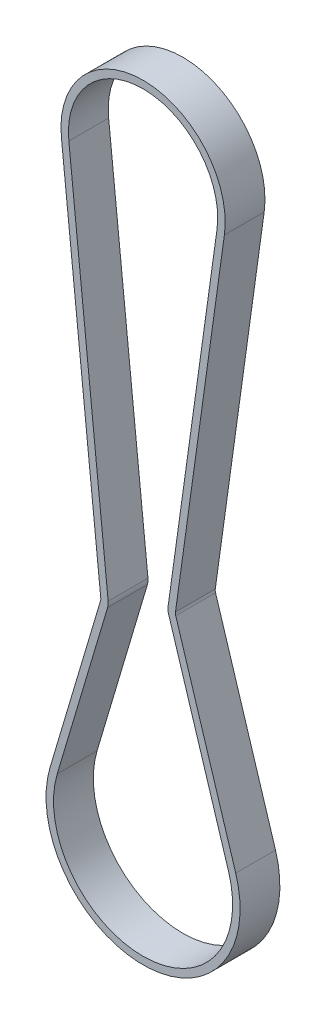
ISO-10303-21;
HEADER;
FILE_DESCRIPTION(('STEP AP214'),'2;1');
FILE_NAME('part.step','',(''),(''),'','','');
FILE_SCHEMA(('AUTOMOTIVE_DESIGN { 1 0 10303 214 1 1 1 1 }'));
ENDSEC;
DATA;
#1=APPLICATION_CONTEXT('core data for automotive mechanical design processes');
#2=APPLICATION_PROTOCOL_DEFINITION('international standard','automotive_design',2000,#1);
#3=PRODUCT_CONTEXT('',#1,'mechanical');
#4=PRODUCT('Part','Part','',(#3));
#5=PRODUCT_RELATED_PRODUCT_CATEGORY('part','',(#4));
#6=PRODUCT_DEFINITION_FORMATION('','',#4);
#7=PRODUCT_DEFINITION_CONTEXT('part definition',#1,'design');
#8=PRODUCT_DEFINITION('design','',#6,#7);
#9=PRODUCT_DEFINITION_SHAPE('','',#8);
#10=(LENGTH_UNIT() NAMED_UNIT(*) SI_UNIT(.MILLI.,.METRE.));
#11=(NAMED_UNIT(*) PLANE_ANGLE_UNIT() SI_UNIT($,.RADIAN.));
#12=(NAMED_UNIT(*) SI_UNIT($,.STERADIAN.) SOLID_ANGLE_UNIT());
#13=UNCERTAINTY_MEASURE_WITH_UNIT(LENGTH_MEASURE(1.E-05),#10,'distance_accuracy_value','');
#14=(GEOMETRIC_REPRESENTATION_CONTEXT(3) GLOBAL_UNCERTAINTY_ASSIGNED_CONTEXT((#13)) GLOBAL_UNIT_ASSIGNED_CONTEXT((#10,
#11,#12)) REPRESENTATION_CONTEXT('',''));
#15=CARTESIAN_POINT('',(0.,0.,0.));
#16=DIRECTION('',(0.,0.,1.));
#17=DIRECTION('',(1.,0.,0.));
#18=AXIS2_PLACEMENT_3D('',#15,#16,#17);
#19=CARTESIAN_POINT('',(8.00000000000001,3.30398469508521,8.));
#20=DIRECTION('',(0.,0.,1.));
#21=DIRECTION('',(1.,0.,0.));
#22=AXIS2_PLACEMENT_3D('',#19,#20,#21);
#23=PLANE('',#22);
#24=DIRECTION('',(-0.138035364293995,-0.990427300817291,0.));
#25=VECTOR('',#24,1.);
#26=CARTESIAN_POINT('',(16.3420504634853,74.0264011842343,8.));
#27=LINE('',#26,#25);
#28=CARTESIAN_POINT('',(16.3420504634853,74.0264011842343,8.));
#29=VERTEX_POINT('',#28);
#30=CARTESIAN_POINT('',(6.51435904877407,3.5110377415262,8.));
#31=VERTEX_POINT('',#30);
#32=EDGE_CURVE('E262',#29,#31,#27,.T.);
#33=ORIENTED_EDGE('',*,*,#32,.F.);
#34=CARTESIAN_POINT('',(0.,76.3039846950852,8.));
#35=DIRECTION('',(0.,0.,1.));
#36=DIRECTION('',(1.,0.,0.));
#37=AXIS2_PLACEMENT_3D('',#34,#35,#36);
#38=CIRCLE('',#37,16.5);
#39=CARTESIAN_POINT('',(-16.4118159133176,74.6003713506388,8.));
#40=VERTEX_POINT('',#39);
#41=EDGE_CURVE('E281',#29,#40,#38,.T.);
#42=ORIENTED_EDGE('',*,*,#41,.T.);
#43=DIRECTION('',(0.103249293602816,-0.994655509898035,0.));
#44=VECTOR('',#43,1.);
#45=CARTESIAN_POINT('',(-16.4118159133176,74.6003713506387,8.));
#46=LINE('',#45,#44);
#47=CARTESIAN_POINT('',(-8.50801673515294,-1.54114136451057,8.));
#48=VERTEX_POINT('',#47);
#49=EDGE_CURVE('E279',#40,#48,#46,.T.);
#50=ORIENTED_EDGE('',*,*,#49,.T.);
#51=CARTESIAN_POINT('',(-9.99999999999999,-1.69601530491479,8.));
#52=DIRECTION('',(0.,0.,1.));
#53=DIRECTION('',(1.,0.,0.));
#54=AXIS2_PLACEMENT_3D('',#51,#52,#53);
#55=CIRCLE('',#54,1.5);
#56=CARTESIAN_POINT('',(-8.56238623534986,-2.12411186375226,8.));
#57=VERTEX_POINT('',#56);
#58=EDGE_CURVE('E276',#57,#48,#55,.T.);
#59=ORIENTED_EDGE('',*,*,#58,.F.);
#60=DIRECTION('',(-0.285397705891645,-0.95840917643342,0.));
#61=VECTOR('',#60,1.);
#62=CARTESIAN_POINT('',(-8.56238623534986,-2.12411186375226,8.));
#63=LINE('',#62,#61);
#64=CARTESIAN_POINT('',(-18.6889789404517,-36.1307600400277,8.));
#65=VERTEX_POINT('',#64);
#66=EDGE_CURVE('E274',#57,#65,#63,.T.);
#67=ORIENTED_EDGE('',*,*,#66,.T.);
#68=CARTESIAN_POINT('',(0.,-41.6960153049148,8.));
#69=DIRECTION('',(0.,0.,1.));
#70=DIRECTION('',(1.,0.,0.));
#71=AXIS2_PLACEMENT_3D('',#68,#69,#70);
#72=CIRCLE('',#71,19.5);
#73=CARTESIAN_POINT('',(18.6206842477136,-35.906359171175,8.));
#74=VERTEX_POINT('',#73);
#75=EDGE_CURVE('E272',#65,#74,#72,.T.);
#76=ORIENTED_EDGE('',*,*,#75,.T.);
#77=DIRECTION('',(0.296905442755887,-0.954906884498133,0.));
#78=VECTOR('',#77,1.);
#79=CARTESIAN_POINT('',(6.56763967325281,2.85862653095138,8.));
#80=LINE('',#79,#78);
#81=CARTESIAN_POINT('',(6.56763967325281,2.85862653095138,8.));
#82=VERTEX_POINT('',#81);
#83=EDGE_CURVE('E269',#82,#74,#80,.T.);
#84=ORIENTED_EDGE('',*,*,#83,.F.);
#85=CARTESIAN_POINT('',(8.00000000000001,3.30398469508521,8.));
#86=DIRECTION('',(0.,0.,1.));
#87=DIRECTION('',(1.,0.,0.));
#88=AXIS2_PLACEMENT_3D('',#85,#86,#87);
#89=CIRCLE('',#88,1.5);
#90=EDGE_CURVE('E265',#31,#82,#89,.T.);
#91=ORIENTED_EDGE('',*,*,#90,.F.);
#92=EDGE_LOOP('',(#33,#42,#50,#59,#67,#76,#84,#91));
#93=FACE_BOUND('',#92,.T.);
#94=DIRECTION('',(0.103249293602816,-0.994655509898035,0.));
#95=VECTOR('',#94,1.);
#96=CARTESIAN_POINT('',(-14.9198326484705,74.755245291043,8.));
#97=LINE('',#96,#95);
#98=CARTESIAN_POINT('',(-14.9198326484705,74.755245291043,8.));
#99=VERTEX_POINT('',#98);
#100=CARTESIAN_POINT('',(-7.01603347030589,-1.38626742410634,8.));
#101=VERTEX_POINT('',#100);
#102=EDGE_CURVE('E203',#99,#101,#97,.T.);
#103=ORIENTED_EDGE('',*,*,#102,.F.);
#104=CARTESIAN_POINT('',(0.,76.3039846950852,8.));
#105=DIRECTION('',(0.,0.,1.));
#106=DIRECTION('',(1.,0.,0.));
#107=AXIS2_PLACEMENT_3D('',#104,#105,#106);
#108=CIRCLE('',#107,15.);
#109=CARTESIAN_POINT('',(14.8564095122594,74.2334542306753,8.));
#110=VERTEX_POINT('',#109);
#111=EDGE_CURVE('E194',#110,#99,#108,.T.);
#112=ORIENTED_EDGE('',*,*,#111,.F.);
#113=DIRECTION('',(-0.138035364293995,-0.990427300817291,0.));
#114=VECTOR('',#113,1.);
#115=CARTESIAN_POINT('',(14.8564095122594,74.2334542306753,8.));
#116=LINE('',#115,#114);
#117=CARTESIAN_POINT('',(5.02871809754814,3.7180907879672,8.));
#118=VERTEX_POINT('',#117);
#119=EDGE_CURVE('E229',#110,#118,#116,.T.);
#120=ORIENTED_EDGE('',*,*,#119,.T.);
#121=CARTESIAN_POINT('',(8.00000000000001,3.30398469508521,8.));
#122=DIRECTION('',(0.,0.,1.));
#123=DIRECTION('',(1.,0.,0.));
#124=AXIS2_PLACEMENT_3D('',#121,#122,#123);
#125=CIRCLE('',#124,3.);
#126=CARTESIAN_POINT('',(5.13527934650561,2.41326836681755,8.));
#127=VERTEX_POINT('',#126);
#128=EDGE_CURVE('E98',#118,#127,#125,.T.);
#129=ORIENTED_EDGE('',*,*,#128,.T.);
#130=DIRECTION('',(0.296905442755888,-0.954906884498133,0.));
#131=VECTOR('',#130,1.);
#132=CARTESIAN_POINT('',(5.13527934650561,2.41326836681755,8.));
#133=LINE('',#132,#131);
#134=CARTESIAN_POINT('',(17.1883239209664,-36.3517173353088,8.));
#135=VERTEX_POINT('',#134);
#136=EDGE_CURVE('E225',#127,#135,#133,.T.);
#137=ORIENTED_EDGE('',*,*,#136,.T.);
#138=CARTESIAN_POINT('',(0.,-41.6960153049148,8.));
#139=DIRECTION('',(0.,0.,1.));
#140=DIRECTION('',(1.,0.,0.));
#141=AXIS2_PLACEMENT_3D('',#138,#139,#140);
#142=CIRCLE('',#141,18.);
#143=CARTESIAN_POINT('',(-17.2513651758015,-36.5588565988652,8.));
#144=VERTEX_POINT('',#143);
#145=EDGE_CURVE('E223',#144,#135,#142,.T.);
#146=ORIENTED_EDGE('',*,*,#145,.F.);
#147=DIRECTION('',(-0.285397705891645,-0.95840917643342,0.));
#148=VECTOR('',#147,1.);
#149=CARTESIAN_POINT('',(-7.12477247069974,-2.55220842258972,8.));
#150=LINE('',#149,#148);
#151=CARTESIAN_POINT('',(-7.12477247069973,-2.55220842258973,8.));
#152=VERTEX_POINT('',#151);
#153=EDGE_CURVE('E219',#152,#144,#150,.T.);
#154=ORIENTED_EDGE('',*,*,#153,.F.);
#155=CARTESIAN_POINT('',(-9.99999999999999,-1.69601530491479,8.));
#156=DIRECTION('',(0.,0.,1.));
#157=DIRECTION('',(1.,0.,0.));
#158=AXIS2_PLACEMENT_3D('',#155,#156,#157);
#159=CIRCLE('',#158,3.);
#160=EDGE_CURVE('E217',#152,#101,#159,.T.);
#161=ORIENTED_EDGE('',*,*,#160,.T.);
#162=EDGE_LOOP('',(#103,#112,#120,#129,#137,#146,#154,#161));
#163=FACE_BOUND('',#162,.T.);
#164=ADVANCED_FACE('F81',(#93,#163),#23,.T.);
#165=CARTESIAN_POINT('',(8.00000000000001,3.30398469508521,0.));
#166=DIRECTION('',(0.,0.,1.));
#167=DIRECTION('',(1.,0.,0.));
#168=AXIS2_PLACEMENT_3D('',#165,#166,#167);
#169=PLANE('',#168);
#170=DIRECTION('',(-0.138035364293995,-0.990427300817291,0.));
#171=VECTOR('',#170,1.);
#172=CARTESIAN_POINT('',(16.3420504634853,74.0264011842343,0.));
#173=LINE('',#172,#171);
#174=CARTESIAN_POINT('',(16.3420504634853,74.0264011842343,0.));
#175=VERTEX_POINT('',#174);
#176=CARTESIAN_POINT('',(6.51435904877407,3.5110377415262,0.));
#177=VERTEX_POINT('',#176);
#178=EDGE_CURVE('E211',#175,#177,#173,.T.);
#179=ORIENTED_EDGE('',*,*,#178,.T.);
#180=CARTESIAN_POINT('',(8.00000000000001,3.30398469508521,0.));
#181=DIRECTION('',(0.,0.,1.));
#182=DIRECTION('',(1.,0.,0.));
#183=AXIS2_PLACEMENT_3D('',#180,#181,#182);
#184=CIRCLE('',#183,1.5);
#185=CARTESIAN_POINT('',(6.56763967325281,2.85862653095138,0.));
#186=VERTEX_POINT('',#185);
#187=EDGE_CURVE('E285',#177,#186,#184,.T.);
#188=ORIENTED_EDGE('',*,*,#187,.T.);
#189=DIRECTION('',(0.296905442755887,-0.954906884498133,0.));
#190=VECTOR('',#189,1.);
#191=CARTESIAN_POINT('',(6.56763967325281,2.85862653095138,0.));
#192=LINE('',#191,#190);
#193=CARTESIAN_POINT('',(18.6206842477136,-35.906359171175,0.));
#194=VERTEX_POINT('',#193);
#195=EDGE_CURVE('E288',#186,#194,#192,.T.);
#196=ORIENTED_EDGE('',*,*,#195,.T.);
#197=CARTESIAN_POINT('',(0.,-41.6960153049148,0.));
#198=DIRECTION('',(0.,0.,1.));
#199=DIRECTION('',(1.,0.,0.));
#200=AXIS2_PLACEMENT_3D('',#197,#198,#199);
#201=CIRCLE('',#200,19.5);
#202=CARTESIAN_POINT('',(-18.6889789404517,-36.1307600400277,0.));
#203=VERTEX_POINT('',#202);
#204=EDGE_CURVE('E291',#203,#194,#201,.T.);
#205=ORIENTED_EDGE('',*,*,#204,.F.);
#206=DIRECTION('',(-0.285397705891645,-0.95840917643342,0.));
#207=VECTOR('',#206,1.);
#208=CARTESIAN_POINT('',(-8.56238623534986,-2.12411186375226,0.));
#209=LINE('',#208,#207);
#210=CARTESIAN_POINT('',(-8.56238623534986,-2.12411186375226,0.));
#211=VERTEX_POINT('',#210);
#212=EDGE_CURVE('E294',#211,#203,#209,.T.);
#213=ORIENTED_EDGE('',*,*,#212,.F.);
#214=CARTESIAN_POINT('',(-9.99999999999999,-1.69601530491479,0.));
#215=DIRECTION('',(0.,0.,1.));
#216=DIRECTION('',(1.,0.,0.));
#217=AXIS2_PLACEMENT_3D('',#214,#215,#216);
#218=CIRCLE('',#217,1.5);
#219=CARTESIAN_POINT('',(-8.50801673515294,-1.54114136451057,0.));
#220=VERTEX_POINT('',#219);
#221=EDGE_CURVE('E296',#211,#220,#218,.T.);
#222=ORIENTED_EDGE('',*,*,#221,.T.);
#223=DIRECTION('',(0.103249293602816,-0.994655509898035,0.));
#224=VECTOR('',#223,1.);
#225=CARTESIAN_POINT('',(-16.4118159133176,74.6003713506387,0.));
#226=LINE('',#225,#224);
#227=CARTESIAN_POINT('',(-16.4118159133176,74.6003713506388,0.));
#228=VERTEX_POINT('',#227);
#229=EDGE_CURVE('E299',#228,#220,#226,.T.);
#230=ORIENTED_EDGE('',*,*,#229,.F.);
#231=CARTESIAN_POINT('',(0.,76.3039846950852,0.));
#232=DIRECTION('',(0.,0.,1.));
#233=DIRECTION('',(1.,0.,0.));
#234=AXIS2_PLACEMENT_3D('',#231,#232,#233);
#235=CIRCLE('',#234,16.5);
#236=EDGE_CURVE('E266',#175,#228,#235,.T.);
#237=ORIENTED_EDGE('',*,*,#236,.F.);
#238=EDGE_LOOP('',(#179,#188,#196,#205,#213,#222,#230,#237));
#239=FACE_BOUND('',#238,.T.);
#240=CARTESIAN_POINT('',(0.,76.3039846950852,0.));
#241=DIRECTION('',(0.,0.,1.));
#242=DIRECTION('',(1.,0.,0.));
#243=AXIS2_PLACEMENT_3D('',#240,#241,#242);
#244=CIRCLE('',#243,15.);
#245=CARTESIAN_POINT('',(14.8564095122594,74.2334542306753,0.));
#246=VERTEX_POINT('',#245);
#247=CARTESIAN_POINT('',(-14.9198326484705,74.755245291043,0.));
#248=VERTEX_POINT('',#247);
#249=EDGE_CURVE('E106',#246,#248,#244,.T.);
#250=ORIENTED_EDGE('',*,*,#249,.T.);
#251=DIRECTION('',(0.103249293602816,-0.994655509898035,0.));
#252=VECTOR('',#251,1.);
#253=CARTESIAN_POINT('',(-14.9198326484705,74.755245291043,0.));
#254=LINE('',#253,#252);
#255=CARTESIAN_POINT('',(-7.01603347030589,-1.38626742410634,0.));
#256=VERTEX_POINT('',#255);
#257=EDGE_CURVE('E210',#248,#256,#254,.T.);
#258=ORIENTED_EDGE('',*,*,#257,.T.);
#259=CARTESIAN_POINT('',(-9.99999999999999,-1.69601530491479,0.));
#260=DIRECTION('',(0.,0.,1.));
#261=DIRECTION('',(1.,0.,0.));
#262=AXIS2_PLACEMENT_3D('',#259,#260,#261);
#263=CIRCLE('',#262,3.);
#264=CARTESIAN_POINT('',(-7.12477247069973,-2.55220842258973,0.));
#265=VERTEX_POINT('',#264);
#266=EDGE_CURVE('E233',#265,#256,#263,.T.);
#267=ORIENTED_EDGE('',*,*,#266,.F.);
#268=DIRECTION('',(-0.285397705891645,-0.95840917643342,0.));
#269=VECTOR('',#268,1.);
#270=CARTESIAN_POINT('',(-7.12477247069974,-2.55220842258972,0.));
#271=LINE('',#270,#269);
#272=CARTESIAN_POINT('',(-17.2513651758015,-36.5588565988652,0.));
#273=VERTEX_POINT('',#272);
#274=EDGE_CURVE('E236',#265,#273,#271,.T.);
#275=ORIENTED_EDGE('',*,*,#274,.T.);
#276=CARTESIAN_POINT('',(0.,-41.6960153049148,0.));
#277=DIRECTION('',(0.,0.,1.));
#278=DIRECTION('',(1.,0.,0.));
#279=AXIS2_PLACEMENT_3D('',#276,#277,#278);
#280=CIRCLE('',#279,18.);
#281=CARTESIAN_POINT('',(17.1883239209664,-36.3517173353088,0.));
#282=VERTEX_POINT('',#281);
#283=EDGE_CURVE('E239',#273,#282,#280,.T.);
#284=ORIENTED_EDGE('',*,*,#283,.T.);
#285=DIRECTION('',(0.296905442755888,-0.954906884498133,0.));
#286=VECTOR('',#285,1.);
#287=CARTESIAN_POINT('',(5.13527934650561,2.41326836681755,0.));
#288=LINE('',#287,#286);
#289=CARTESIAN_POINT('',(5.13527934650561,2.41326836681755,0.));
#290=VERTEX_POINT('',#289);
#291=EDGE_CURVE('E242',#290,#282,#288,.T.);
#292=ORIENTED_EDGE('',*,*,#291,.F.);
#293=CARTESIAN_POINT('',(8.00000000000001,3.30398469508521,0.));
#294=DIRECTION('',(0.,0.,1.));
#295=DIRECTION('',(1.,0.,0.));
#296=AXIS2_PLACEMENT_3D('',#293,#294,#295);
#297=CIRCLE('',#296,3.);
#298=CARTESIAN_POINT('',(5.02871809754814,3.7180907879672,0.));
#299=VERTEX_POINT('',#298);
#300=EDGE_CURVE('E245',#299,#290,#297,.T.);
#301=ORIENTED_EDGE('',*,*,#300,.F.);
#302=DIRECTION('',(-0.138035364293995,-0.990427300817291,0.));
#303=VECTOR('',#302,1.);
#304=CARTESIAN_POINT('',(14.8564095122594,74.2334542306753,0.));
#305=LINE('',#304,#303);
#306=EDGE_CURVE('E204',#246,#299,#305,.T.);
#307=ORIENTED_EDGE('',*,*,#306,.F.);
#308=EDGE_LOOP('',(#250,#258,#267,#275,#284,#292,#301,#307));
#309=FACE_BOUND('',#308,.T.);
#310=ADVANCED_FACE('F324',(#239,#309),#169,.F.);
#311=CARTESIAN_POINT('',(16.3420504634853,74.0264011842343,8.));
#312=DIRECTION('',(0.990427300817291,-0.138035364293995,0.));
#313=DIRECTION('',(0.138035364293995,0.990427300817291,0.));
#314=AXIS2_PLACEMENT_3D('',#311,#312,#313);
#315=PLANE('',#314);
#316=ORIENTED_EDGE('',*,*,#178,.F.);
#317=DIRECTION('',(0.,0.,-1.));
#318=VECTOR('',#317,1.);
#319=CARTESIAN_POINT('',(16.3420504634853,74.0264011842343,8.));
#320=LINE('',#319,#318);
#321=EDGE_CURVE('E12',#29,#175,#320,.T.);
#322=ORIENTED_EDGE('',*,*,#321,.F.);
#323=ORIENTED_EDGE('',*,*,#32,.T.);
#324=DIRECTION('',(0.,0.,-1.));
#325=VECTOR('',#324,1.);
#326=CARTESIAN_POINT('',(6.51435904877407,3.5110377415262,8.));
#327=LINE('',#326,#325);
#328=EDGE_CURVE('E85',#31,#177,#327,.T.);
#329=ORIENTED_EDGE('',*,*,#328,.T.);
#330=EDGE_LOOP('',(#316,#322,#323,#329));
#331=FACE_BOUND('',#330,.T.);
#332=ADVANCED_FACE('F83',(#331),#315,.T.);
#333=CARTESIAN_POINT('',(0.,76.3039846950852,8.));
#334=DIRECTION('',(0.,0.,-1.));
#335=DIRECTION('',(-1.,0.,0.));
#336=AXIS2_PLACEMENT_3D('',#333,#334,#335);
#337=CYLINDRICAL_SURFACE('',#336,16.5);
#338=ORIENTED_EDGE('',*,*,#236,.T.);
#339=DIRECTION('',(0.,0.,-1.));
#340=VECTOR('',#339,1.);
#341=CARTESIAN_POINT('',(-16.4118159133176,74.6003713506388,8.));
#342=LINE('',#341,#340);
#343=EDGE_CURVE('E90',#40,#228,#342,.T.);
#344=ORIENTED_EDGE('',*,*,#343,.F.);
#345=ORIENTED_EDGE('',*,*,#41,.F.);
#346=ORIENTED_EDGE('',*,*,#321,.T.);
#347=EDGE_LOOP('',(#338,#344,#345,#346));
#348=FACE_BOUND('',#347,.T.);
#349=ADVANCED_FACE('F329',(#348),#337,.T.);
#350=CARTESIAN_POINT('',(-16.4118159133176,74.6003713506387,8.));
#351=DIRECTION('',(0.994655509898035,0.103249293602816,0.));
#352=DIRECTION('',(-0.103249293602816,0.994655509898035,0.));
#353=AXIS2_PLACEMENT_3D('',#350,#351,#352);
#354=PLANE('',#353);
#355=ORIENTED_EDGE('',*,*,#229,.T.);
#356=DIRECTION('',(0.,0.,-1.));
#357=VECTOR('',#356,1.);
#358=CARTESIAN_POINT('',(-8.50801673515294,-1.54114136451057,8.));
#359=LINE('',#358,#357);
#360=EDGE_CURVE('E305',#48,#220,#359,.T.);
#361=ORIENTED_EDGE('',*,*,#360,.F.);
#362=ORIENTED_EDGE('',*,*,#49,.F.);
#363=ORIENTED_EDGE('',*,*,#343,.T.);
#364=EDGE_LOOP('',(#355,#361,#362,#363));
#365=FACE_BOUND('',#364,.T.);
#366=ADVANCED_FACE('F333',(#365),#354,.F.);
#367=CARTESIAN_POINT('',(-9.99999999999999,-1.69601530491479,8.));
#368=DIRECTION('',(0.,0.,-1.));
#369=DIRECTION('',(-1.,0.,0.));
#370=AXIS2_PLACEMENT_3D('',#367,#368,#369);
#371=CYLINDRICAL_SURFACE('',#370,1.5);
#372=ORIENTED_EDGE('',*,*,#221,.F.);
#373=DIRECTION('',(0.,0.,-1.));
#374=VECTOR('',#373,1.);
#375=CARTESIAN_POINT('',(-8.56238623534986,-2.12411186375226,8.));
#376=LINE('',#375,#374);
#377=EDGE_CURVE('E307',#57,#211,#376,.T.);
#378=ORIENTED_EDGE('',*,*,#377,.F.);
#379=ORIENTED_EDGE('',*,*,#58,.T.);
#380=ORIENTED_EDGE('',*,*,#360,.T.);
#381=EDGE_LOOP('',(#372,#378,#379,#380));
#382=FACE_BOUND('',#381,.T.);
#383=ADVANCED_FACE('F352',(#382),#371,.F.);
#384=CARTESIAN_POINT('',(-8.56238623534986,-2.12411186375226,8.));
#385=DIRECTION('',(0.95840917643342,-0.285397705891645,0.));
#386=DIRECTION('',(0.285397705891645,0.95840917643342,0.));
#387=AXIS2_PLACEMENT_3D('',#384,#385,#386);
#388=PLANE('',#387);
#389=ORIENTED_EDGE('',*,*,#212,.T.);
#390=DIRECTION('',(0.,0.,-1.));
#391=VECTOR('',#390,1.);
#392=CARTESIAN_POINT('',(-18.6889789404517,-36.1307600400277,8.));
#393=LINE('',#392,#391);
#394=EDGE_CURVE('E309',#65,#203,#393,.T.);
#395=ORIENTED_EDGE('',*,*,#394,.F.);
#396=ORIENTED_EDGE('',*,*,#66,.F.);
#397=ORIENTED_EDGE('',*,*,#377,.T.);
#398=EDGE_LOOP('',(#389,#395,#396,#397));
#399=FACE_BOUND('',#398,.T.);
#400=ADVANCED_FACE('F350',(#399),#388,.F.);
#401=CARTESIAN_POINT('',(0.,-41.6960153049148,8.));
#402=DIRECTION('',(0.,0.,-1.));
#403=DIRECTION('',(-1.,0.,0.));
#404=AXIS2_PLACEMENT_3D('',#401,#402,#403);
#405=CYLINDRICAL_SURFACE('',#404,19.5);
#406=ORIENTED_EDGE('',*,*,#204,.T.);
#407=DIRECTION('',(0.,0.,-1.));
#408=VECTOR('',#407,1.);
#409=CARTESIAN_POINT('',(18.6206842477136,-35.906359171175,8.));
#410=LINE('',#409,#408);
#411=EDGE_CURVE('E312',#74,#194,#410,.T.);
#412=ORIENTED_EDGE('',*,*,#411,.F.);
#413=ORIENTED_EDGE('',*,*,#75,.F.);
#414=ORIENTED_EDGE('',*,*,#394,.T.);
#415=EDGE_LOOP('',(#406,#412,#413,#414));
#416=FACE_BOUND('',#415,.T.);
#417=ADVANCED_FACE('F346',(#416),#405,.T.);
#418=CARTESIAN_POINT('',(6.56763967325281,2.85862653095138,8.));
#419=DIRECTION('',(0.954906884498133,0.296905442755887,0.));
#420=DIRECTION('',(-0.296905442755887,0.954906884498133,0.));
#421=AXIS2_PLACEMENT_3D('',#418,#419,#420);
#422=PLANE('',#421);
#423=ORIENTED_EDGE('',*,*,#195,.F.);
#424=DIRECTION('',(0.,0.,-1.));
#425=VECTOR('',#424,1.);
#426=CARTESIAN_POINT('',(6.56763967325281,2.85862653095138,8.));
#427=LINE('',#426,#425);
#428=EDGE_CURVE('E313',#82,#186,#427,.T.);
#429=ORIENTED_EDGE('',*,*,#428,.F.);
#430=ORIENTED_EDGE('',*,*,#83,.T.);
#431=ORIENTED_EDGE('',*,*,#411,.T.);
#432=EDGE_LOOP('',(#423,#429,#430,#431));
#433=FACE_BOUND('',#432,.T.);
#434=ADVANCED_FACE('F341',(#433),#422,.T.);
#435=CARTESIAN_POINT('',(8.00000000000001,3.30398469508521,8.));
#436=DIRECTION('',(0.,0.,-1.));
#437=DIRECTION('',(-1.,0.,0.));
#438=AXIS2_PLACEMENT_3D('',#435,#436,#437);
#439=CYLINDRICAL_SURFACE('',#438,1.5);
#440=ORIENTED_EDGE('',*,*,#187,.F.);
#441=ORIENTED_EDGE('',*,*,#328,.F.);
#442=ORIENTED_EDGE('',*,*,#90,.T.);
#443=ORIENTED_EDGE('',*,*,#428,.T.);
#444=EDGE_LOOP('',(#440,#441,#442,#443));
#445=FACE_BOUND('',#444,.T.);
#446=ADVANCED_FACE('F321',(#445),#439,.F.);
#447=CARTESIAN_POINT('',(0.,76.3039846950852,8.));
#448=DIRECTION('',(0.,0.,-1.));
#449=DIRECTION('',(-1.,0.,0.));
#450=AXIS2_PLACEMENT_3D('',#447,#448,#449);
#451=CYLINDRICAL_SURFACE('',#450,15.);
#452=ORIENTED_EDGE('',*,*,#249,.F.);
#453=DIRECTION('',(0.,0.,-1.));
#454=VECTOR('',#453,1.);
#455=CARTESIAN_POINT('',(14.8564095122594,74.2334542306753,8.));
#456=LINE('',#455,#454);
#457=EDGE_CURVE('E198',#110,#246,#456,.T.);
#458=ORIENTED_EDGE('',*,*,#457,.F.);
#459=ORIENTED_EDGE('',*,*,#111,.T.);
#460=DIRECTION('',(0.,0.,-1.));
#461=VECTOR('',#460,1.);
#462=CARTESIAN_POINT('',(-14.9198326484705,74.755245291043,8.));
#463=LINE('',#462,#461);
#464=EDGE_CURVE('E197',#99,#248,#463,.T.);
#465=ORIENTED_EDGE('',*,*,#464,.T.);
#466=EDGE_LOOP('',(#452,#458,#459,#465));
#467=FACE_BOUND('',#466,.T.);
#468=ADVANCED_FACE('F196',(#467),#451,.F.);
#469=CARTESIAN_POINT('',(-14.9198326484705,74.755245291043,8.));
#470=DIRECTION('',(0.994655509898035,0.103249293602816,0.));
#471=DIRECTION('',(-0.103249293602816,0.994655509898035,0.));
#472=AXIS2_PLACEMENT_3D('',#469,#470,#471);
#473=PLANE('',#472);
#474=ORIENTED_EDGE('',*,*,#257,.F.);
#475=ORIENTED_EDGE('',*,*,#464,.F.);
#476=ORIENTED_EDGE('',*,*,#102,.T.);
#477=DIRECTION('',(0.,0.,-1.));
#478=VECTOR('',#477,1.);
#479=CARTESIAN_POINT('',(-7.01603347030589,-1.38626742410634,8.));
#480=LINE('',#479,#478);
#481=EDGE_CURVE('E212',#101,#256,#480,.T.);
#482=ORIENTED_EDGE('',*,*,#481,.T.);
#483=EDGE_LOOP('',(#474,#475,#476,#482));
#484=FACE_BOUND('',#483,.T.);
#485=ADVANCED_FACE('F207',(#484),#473,.T.);
#486=CARTESIAN_POINT('',(-9.99999999999999,-1.69601530491479,8.));
#487=DIRECTION('',(0.,0.,-1.));
#488=DIRECTION('',(-1.,0.,0.));
#489=AXIS2_PLACEMENT_3D('',#486,#487,#488);
#490=CYLINDRICAL_SURFACE('',#489,3.);
#491=ORIENTED_EDGE('',*,*,#266,.T.);
#492=ORIENTED_EDGE('',*,*,#481,.F.);
#493=ORIENTED_EDGE('',*,*,#160,.F.);
#494=DIRECTION('',(0.,0.,-1.));
#495=VECTOR('',#494,1.);
#496=CARTESIAN_POINT('',(-7.12477247069973,-2.55220842258973,8.));
#497=LINE('',#496,#495);
#498=EDGE_CURVE('E259',#152,#265,#497,.T.);
#499=ORIENTED_EDGE('',*,*,#498,.T.);
#500=EDGE_LOOP('',(#491,#492,#493,#499));
#501=FACE_BOUND('',#500,.T.);
#502=ADVANCED_FACE('F440',(#501),#490,.T.);
#503=CARTESIAN_POINT('',(-7.12477247069974,-2.55220842258972,8.));
#504=DIRECTION('',(0.95840917643342,-0.285397705891645,0.));
#505=DIRECTION('',(0.285397705891645,0.95840917643342,0.));
#506=AXIS2_PLACEMENT_3D('',#503,#504,#505);
#507=PLANE('',#506);
#508=ORIENTED_EDGE('',*,*,#274,.F.);
#509=ORIENTED_EDGE('',*,*,#498,.F.);
#510=ORIENTED_EDGE('',*,*,#153,.T.);
#511=DIRECTION('',(0.,0.,-1.));
#512=VECTOR('',#511,1.);
#513=CARTESIAN_POINT('',(-17.2513651758015,-36.5588565988652,8.));
#514=LINE('',#513,#512);
#515=EDGE_CURVE('E257',#144,#273,#514,.T.);
#516=ORIENTED_EDGE('',*,*,#515,.T.);
#517=EDGE_LOOP('',(#508,#509,#510,#516));
#518=FACE_BOUND('',#517,.T.);
#519=ADVANCED_FACE('F447',(#518),#507,.T.);
#520=CARTESIAN_POINT('',(0.,-41.6960153049148,8.));
#521=DIRECTION('',(0.,0.,-1.));
#522=DIRECTION('',(-1.,0.,0.));
#523=AXIS2_PLACEMENT_3D('',#520,#521,#522);
#524=CYLINDRICAL_SURFACE('',#523,18.);
#525=ORIENTED_EDGE('',*,*,#283,.F.);
#526=ORIENTED_EDGE('',*,*,#515,.F.);
#527=ORIENTED_EDGE('',*,*,#145,.T.);
#528=DIRECTION('',(0.,0.,-1.));
#529=VECTOR('',#528,1.);
#530=CARTESIAN_POINT('',(17.1883239209664,-36.3517173353088,8.));
#531=LINE('',#530,#529);
#532=EDGE_CURVE('E255',#135,#282,#531,.T.);
#533=ORIENTED_EDGE('',*,*,#532,.T.);
#534=EDGE_LOOP('',(#525,#526,#527,#533));
#535=FACE_BOUND('',#534,.T.);
#536=ADVANCED_FACE('F456',(#535),#524,.F.);
#537=CARTESIAN_POINT('',(5.13527934650561,2.41326836681755,8.));
#538=DIRECTION('',(0.954906884498133,0.296905442755887,0.));
#539=DIRECTION('',(-0.296905442755888,0.954906884498133,0.));
#540=AXIS2_PLACEMENT_3D('',#537,#538,#539);
#541=PLANE('',#540);
#542=ORIENTED_EDGE('',*,*,#291,.T.);
#543=ORIENTED_EDGE('',*,*,#532,.F.);
#544=ORIENTED_EDGE('',*,*,#136,.F.);
#545=DIRECTION('',(0.,0.,-1.));
#546=VECTOR('',#545,1.);
#547=CARTESIAN_POINT('',(5.13527934650561,2.41326836681755,8.));
#548=LINE('',#547,#546);
#549=EDGE_CURVE('E253',#127,#290,#548,.T.);
#550=ORIENTED_EDGE('',*,*,#549,.T.);
#551=EDGE_LOOP('',(#542,#543,#544,#550));
#552=FACE_BOUND('',#551,.T.);
#553=ADVANCED_FACE('F465',(#552),#541,.F.);
#554=CARTESIAN_POINT('',(8.00000000000001,3.30398469508521,8.));
#555=DIRECTION('',(0.,0.,-1.));
#556=DIRECTION('',(-1.,0.,0.));
#557=AXIS2_PLACEMENT_3D('',#554,#555,#556);
#558=CYLINDRICAL_SURFACE('',#557,3.);
#559=ORIENTED_EDGE('',*,*,#300,.T.);
#560=ORIENTED_EDGE('',*,*,#549,.F.);
#561=ORIENTED_EDGE('',*,*,#128,.F.);
#562=DIRECTION('',(0.,0.,-1.));
#563=VECTOR('',#562,1.);
#564=CARTESIAN_POINT('',(5.02871809754814,3.7180907879672,8.));
#565=LINE('',#564,#563);
#566=EDGE_CURVE('E251',#118,#299,#565,.T.);
#567=ORIENTED_EDGE('',*,*,#566,.T.);
#568=EDGE_LOOP('',(#559,#560,#561,#567));
#569=FACE_BOUND('',#568,.T.);
#570=ADVANCED_FACE('F474',(#569),#558,.T.);
#571=CARTESIAN_POINT('',(14.8564095122594,74.2334542306753,8.));
#572=DIRECTION('',(0.990427300817291,-0.138035364293995,0.));
#573=DIRECTION('',(0.138035364293995,0.990427300817291,0.));
#574=AXIS2_PLACEMENT_3D('',#571,#572,#573);
#575=PLANE('',#574);
#576=ORIENTED_EDGE('',*,*,#306,.T.);
#577=ORIENTED_EDGE('',*,*,#566,.F.);
#578=ORIENTED_EDGE('',*,*,#119,.F.);
#579=ORIENTED_EDGE('',*,*,#457,.T.);
#580=EDGE_LOOP('',(#576,#577,#578,#579));
#581=FACE_BOUND('',#580,.T.);
#582=ADVANCED_FACE('F483',(#581),#575,.F.);
#583=CLOSED_SHELL('',(#164,#310,#332,#349,#366,#383,#400,#417,#434,#446,#468,#485,#502,#519,
#536,#553,#570,#582));
#584=MANIFOLD_SOLID_BREP('B2',#583);
#585=ADVANCED_BREP_SHAPE_REPRESENTATION('',(#18,#584),#14);
#586=SHAPE_DEFINITION_REPRESENTATION(#9,#585);
ENDSEC;
END-ISO-10303-21;
